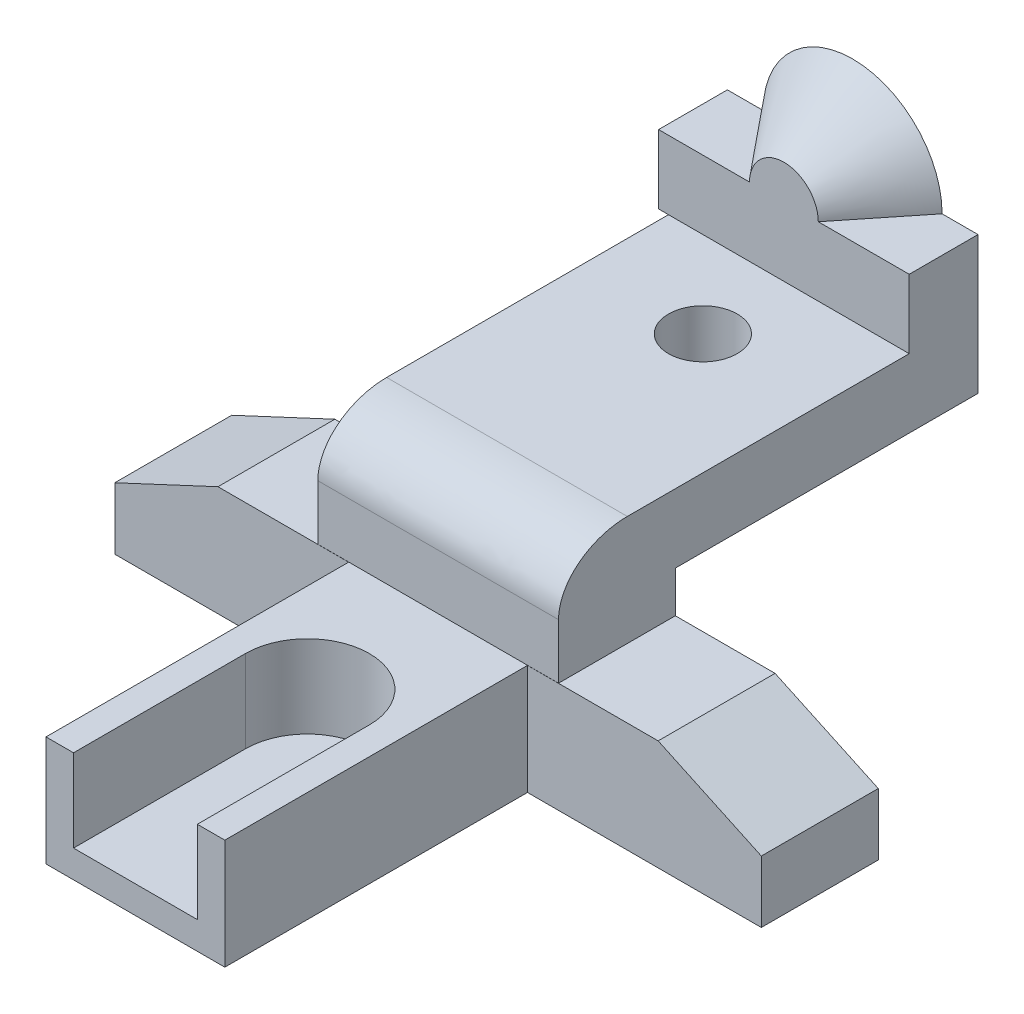
ISO-10303-21;
HEADER;
FILE_DESCRIPTION(('STEP AP214'),'2;1');
FILE_NAME('part.step','',(''),(''),'','','');
FILE_SCHEMA(('AUTOMOTIVE_DESIGN { 1 0 10303 214 1 1 1 1 }'));
ENDSEC;
DATA;
#1=APPLICATION_CONTEXT('core data for automotive mechanical design processes');
#2=APPLICATION_PROTOCOL_DEFINITION('international standard','automotive_design',2000,#1);
#3=PRODUCT_CONTEXT('',#1,'mechanical');
#4=PRODUCT('Part','Part','',(#3));
#5=PRODUCT_RELATED_PRODUCT_CATEGORY('part','',(#4));
#6=PRODUCT_DEFINITION_FORMATION('','',#4);
#7=PRODUCT_DEFINITION_CONTEXT('part definition',#1,'design');
#8=PRODUCT_DEFINITION('design','',#6,#7);
#9=PRODUCT_DEFINITION_SHAPE('','',#8);
#10=(LENGTH_UNIT() NAMED_UNIT(*) SI_UNIT(.MILLI.,.METRE.));
#11=(NAMED_UNIT(*) PLANE_ANGLE_UNIT() SI_UNIT($,.RADIAN.));
#12=(NAMED_UNIT(*) SI_UNIT($,.STERADIAN.) SOLID_ANGLE_UNIT());
#13=UNCERTAINTY_MEASURE_WITH_UNIT(LENGTH_MEASURE(1.E-05),#10,'distance_accuracy_value','');
#14=(GEOMETRIC_REPRESENTATION_CONTEXT(3) GLOBAL_UNCERTAINTY_ASSIGNED_CONTEXT((#13)) GLOBAL_UNIT_ASSIGNED_CONTEXT((#10,
#11,#12)) REPRESENTATION_CONTEXT('',''));
#15=CARTESIAN_POINT('',(0.,0.,0.));
#16=DIRECTION('',(0.,0.,1.));
#17=DIRECTION('',(1.,0.,0.));
#18=AXIS2_PLACEMENT_3D('',#15,#16,#17);
#19=CARTESIAN_POINT('',(0.,42.,0.));
#20=DIRECTION('',(0.,-1.,0.));
#21=DIRECTION('',(0.,0.,-1.));
#22=AXIS2_PLACEMENT_3D('',#19,#20,#21);
#23=PLANE('',#22);
#24=DIRECTION('',(-0.624695047554424,0.,-0.78086880944303));
#25=VECTOR('',#24,1.);
#26=CARTESIAN_POINT('',(41.2810746041064,42.,-51.));
#27=LINE('',#26,#25);
#28=CARTESIAN_POINT('',(41.2810746041064,42.,-51.));
#29=VERTEX_POINT('',#28);
#30=CARTESIAN_POINT('',(33.2810746041064,42.,-61.));
#31=VERTEX_POINT('',#30);
#32=EDGE_CURVE('E246',#29,#31,#27,.T.);
#33=ORIENTED_EDGE('',*,*,#32,.T.);
#34=DIRECTION('',(-1.,0.,0.));
#35=VECTOR('',#34,1.);
#36=CARTESIAN_POINT('',(28.0621492082127,42.,-61.));
#37=LINE('',#36,#35);
#38=CARTESIAN_POINT('',(28.0621492082127,42.,-61.));
#39=VERTEX_POINT('',#38);
#40=EDGE_CURVE('E236',#31,#39,#37,.T.);
#41=ORIENTED_EDGE('',*,*,#40,.T.);
#42=DIRECTION('',(0.,0.,1.));
#43=VECTOR('',#42,1.);
#44=CARTESIAN_POINT('',(28.0621492082127,42.,-51.));
#45=LINE('',#44,#43);
#46=CARTESIAN_POINT('',(28.0621492082127,42.,-51.));
#47=VERTEX_POINT('',#46);
#48=EDGE_CURVE('E235',#39,#47,#45,.T.);
#49=ORIENTED_EDGE('',*,*,#48,.T.);
#50=DIRECTION('',(1.,0.,0.));
#51=VECTOR('',#50,1.);
#52=CARTESIAN_POINT('',(28.0621492082127,42.,-51.));
#53=LINE('',#52,#51);
#54=EDGE_CURVE('E77',#47,#29,#53,.T.);
#55=ORIENTED_EDGE('',*,*,#54,.T.);
#56=EDGE_LOOP('',(#33,#41,#49,#55));
#57=FACE_BOUND('',#56,.T.);
#58=ADVANCED_FACE('F47',(#57),#23,.F.);
#59=DIRECTION('',(0.624695047554424,0.,-0.78086880944303));
#60=VECTOR('',#59,1.);
#61=CARTESIAN_POINT('',(51.2810746041064,42.,-51.));
#62=LINE('',#61,#60);
#63=CARTESIAN_POINT('',(51.2810746041064,42.,-51.));
#64=VERTEX_POINT('',#63);
#65=CARTESIAN_POINT('',(59.2810746041064,42.,-61.));
#66=VERTEX_POINT('',#65);
#67=EDGE_CURVE('E69',#64,#66,#62,.T.);
#68=ORIENTED_EDGE('',*,*,#67,.F.);
#69=CARTESIAN_POINT('',(64.5,42.,-51.));
#70=VERTEX_POINT('',#69);
#71=EDGE_CURVE('E270',#64,#70,#53,.T.);
#72=ORIENTED_EDGE('',*,*,#71,.T.);
#73=DIRECTION('',(0.,0.,-1.));
#74=VECTOR('',#73,1.);
#75=CARTESIAN_POINT('',(64.5,42.,-51.));
#76=LINE('',#75,#74);
#77=CARTESIAN_POINT('',(64.5,42.,-61.));
#78=VERTEX_POINT('',#77);
#79=EDGE_CURVE('E231',#70,#78,#76,.T.);
#80=ORIENTED_EDGE('',*,*,#79,.T.);
#81=EDGE_CURVE('E228',#78,#66,#37,.T.);
#82=ORIENTED_EDGE('',*,*,#81,.T.);
#83=EDGE_LOOP('',(#68,#72,#80,#82));
#84=FACE_BOUND('',#83,.T.);
#85=ADVANCED_FACE('F229',(#84),#23,.F.);
#86=CARTESIAN_POINT('',(0.,32.,0.));
#87=DIRECTION('',(0.,-1.,0.));
#88=DIRECTION('',(1.,0.,0.));
#89=AXIS2_PLACEMENT_3D('',#86,#87,#88);
#90=PLANE('',#89);
#91=CARTESIAN_POINT('',(47.,32.,-38.5));
#92=DIRECTION('',(0.,1.,0.));
#93=DIRECTION('',(-1.,0.,0.));
#94=AXIS2_PLACEMENT_3D('',#91,#92,#93);
#95=CIRCLE('',#94,5.);
#96=CARTESIAN_POINT('',(42.,32.,-38.5));
#97=VERTEX_POINT('',#96);
#98=EDGE_CURVE('E253',#97,#97,#95,.T.);
#99=ORIENTED_EDGE('',*,*,#98,.F.);
#100=EDGE_LOOP('',(#99));
#101=FACE_BOUND('',#100,.T.);
#102=DIRECTION('',(0.,0.,1.));
#103=VECTOR('',#102,1.);
#104=CARTESIAN_POINT('',(29.5,32.,-0.0186477456421091));
#105=LINE('',#104,#103);
#106=CARTESIAN_POINT('',(29.5,32.,-51.));
#107=VERTEX_POINT('',#106);
#108=CARTESIAN_POINT('',(29.5,32.,-10.0186477456421));
#109=VERTEX_POINT('',#108);
#110=EDGE_CURVE('E326',#107,#109,#105,.T.);
#111=ORIENTED_EDGE('',*,*,#110,.T.);
#112=CARTESIAN_POINT('',(66.25,32.,-10.0186477456421));
#113=CARTESIAN_POINT('',(53.4166666666667,32.,-10.0186477456421));
#114=CARTESIAN_POINT('',(40.5833333333333,32.,-10.0186477456421));
#115=CARTESIAN_POINT('',(27.75,32.,-10.0186477456421));
#116=(BOUNDED_CURVE() B_SPLINE_CURVE(3,(#112,#113,#114,#115),.UNSPECIFIED.,.F.,
.F.) B_SPLINE_CURVE_WITH_KNOTS((4,4),(0.02775,0.06625),
.UNSPECIFIED.) CURVE() GEOMETRIC_REPRESENTATION_ITEM() RATIONAL_B_SPLINE_CURVE((1.,1.,1.,1.)) REPRESENTATION_ITEM(''));
#117=CARTESIAN_POINT('',(64.5,32.,-10.0186477456421));
#118=VERTEX_POINT('',#117);
#119=EDGE_CURVE('E334',#109,#118,#116,.F.);
#120=ORIENTED_EDGE('',*,*,#119,.T.);
#121=DIRECTION('',(0.,0.,-1.));
#122=VECTOR('',#121,1.);
#123=CARTESIAN_POINT('',(64.5,32.,-0.0186477456421091));
#124=LINE('',#123,#122);
#125=CARTESIAN_POINT('',(64.5,32.,-51.));
#126=VERTEX_POINT('',#125);
#127=EDGE_CURVE('E322',#118,#126,#124,.T.);
#128=ORIENTED_EDGE('',*,*,#127,.T.);
#129=DIRECTION('',(1.,0.,0.));
#130=VECTOR('',#129,1.);
#131=CARTESIAN_POINT('',(28.0621492082127,32.,-51.));
#132=LINE('',#131,#130);
#133=EDGE_CURVE('E282',#107,#126,#132,.T.);
#134=ORIENTED_EDGE('',*,*,#133,.F.);
#135=EDGE_LOOP('',(#111,#120,#128,#134));
#136=FACE_BOUND('',#135,.T.);
#137=ADVANCED_FACE('F343',(#101,#136),#90,.F.);
#138=CARTESIAN_POINT('',(0.,0.,-17.));
#139=DIRECTION('',(0.,0.,1.));
#140=DIRECTION('',(1.,0.,0.));
#141=AXIS2_PLACEMENT_3D('',#138,#139,#140);
#142=PLANE('',#141);
#143=DIRECTION('',(-1.,0.,0.));
#144=VECTOR('',#143,1.);
#145=CARTESIAN_POINT('',(64.5,22.,-17.));
#146=LINE('',#145,#144);
#147=CARTESIAN_POINT('',(64.5,22.,-17.));
#148=VERTEX_POINT('',#147);
#149=CARTESIAN_POINT('',(29.5,22.,-17.));
#150=VERTEX_POINT('',#149);
#151=EDGE_CURVE('E294',#148,#150,#146,.T.);
#152=ORIENTED_EDGE('',*,*,#151,.F.);
#153=DIRECTION('',(0.,-1.,0.));
#154=VECTOR('',#153,1.);
#155=CARTESIAN_POINT('',(64.5,32.,-17.));
#156=LINE('',#155,#154);
#157=CARTESIAN_POINT('',(64.5,16.,-17.));
#158=VERTEX_POINT('',#157);
#159=EDGE_CURVE('E582',#148,#158,#156,.T.);
#160=ORIENTED_EDGE('',*,*,#159,.T.);
#161=DIRECTION('',(-1.,0.,0.));
#162=VECTOR('',#161,1.);
#163=CARTESIAN_POINT('',(79.,16.,-17.));
#164=LINE('',#163,#162);
#165=CARTESIAN_POINT('',(79.,16.,-17.));
#166=VERTEX_POINT('',#165);
#167=EDGE_CURVE('E458',#166,#158,#164,.T.);
#168=ORIENTED_EDGE('',*,*,#167,.F.);
#169=DIRECTION('',(-0.906183139995265,0.422885465331124,0.));
#170=VECTOR('',#169,1.);
#171=CARTESIAN_POINT('',(94.,9.,-17.));
#172=LINE('',#171,#170);
#173=CARTESIAN_POINT('',(94.,9.,-17.));
#174=VERTEX_POINT('',#173);
#175=EDGE_CURVE('E676',#174,#166,#172,.T.);
#176=ORIENTED_EDGE('',*,*,#175,.F.);
#177=DIRECTION('',(0.,1.,0.));
#178=VECTOR('',#177,1.);
#179=CARTESIAN_POINT('',(94.,0.,-17.));
#180=LINE('',#179,#178);
#181=CARTESIAN_POINT('',(94.,0.,-17.));
#182=VERTEX_POINT('',#181);
#183=EDGE_CURVE('E672',#182,#174,#180,.T.);
#184=ORIENTED_EDGE('',*,*,#183,.F.);
#185=DIRECTION('',(1.,0.,0.));
#186=VECTOR('',#185,1.);
#187=CARTESIAN_POINT('',(0.,0.,-17.));
#188=LINE('',#187,#186);
#189=CARTESIAN_POINT('',(0.,0.,-17.));
#190=VERTEX_POINT('',#189);
#191=EDGE_CURVE('E666',#190,#182,#188,.T.);
#192=ORIENTED_EDGE('',*,*,#191,.F.);
#193=DIRECTION('',(0.,-1.,0.));
#194=VECTOR('',#193,1.);
#195=CARTESIAN_POINT('',(0.,9.,-17.));
#196=LINE('',#195,#194);
#197=CARTESIAN_POINT('',(0.,9.,-17.));
#198=VERTEX_POINT('',#197);
#199=EDGE_CURVE('E493',#198,#190,#196,.T.);
#200=ORIENTED_EDGE('',*,*,#199,.F.);
#201=DIRECTION('',(-0.906183139995266,-0.422885465331123,0.));
#202=VECTOR('',#201,1.);
#203=CARTESIAN_POINT('',(15.,16.,-17.));
#204=LINE('',#203,#202);
#205=CARTESIAN_POINT('',(15.,16.,-17.));
#206=VERTEX_POINT('',#205);
#207=EDGE_CURVE('E453',#206,#198,#204,.T.);
#208=ORIENTED_EDGE('',*,*,#207,.F.);
#209=CARTESIAN_POINT('',(29.5,16.,-17.));
#210=VERTEX_POINT('',#209);
#211=EDGE_CURVE('E464',#210,#206,#164,.T.);
#212=ORIENTED_EDGE('',*,*,#211,.F.);
#213=DIRECTION('',(0.,-1.,0.));
#214=VECTOR('',#213,1.);
#215=CARTESIAN_POINT('',(29.5,32.,-17.));
#216=LINE('',#215,#214);
#217=EDGE_CURVE('E555',#150,#210,#216,.T.);
#218=ORIENTED_EDGE('',*,*,#217,.F.);
#219=EDGE_LOOP('',(#152,#160,#168,#176,#184,#192,#200,#208,#212,#218));
#220=FACE_BOUND('',#219,.T.);
#221=ADVANCED_FACE('F353',(#220),#142,.F.);
#222=CARTESIAN_POINT('',(0.,0.,0.));
#223=DIRECTION('',(0.,0.,1.));
#224=DIRECTION('',(1.,0.,0.));
#225=AXIS2_PLACEMENT_3D('',#222,#223,#224);
#226=PLANE('',#225);
#227=DIRECTION('',(0.,1.,0.));
#228=VECTOR('',#227,1.);
#229=CARTESIAN_POINT('',(60.,16.,0.));
#230=LINE('',#229,#228);
#231=CARTESIAN_POINT('',(60.,0.,0.));
#232=VERTEX_POINT('',#231);
#233=CARTESIAN_POINT('',(60.,16.,0.));
#234=VERTEX_POINT('',#233);
#235=EDGE_CURVE('E623',#232,#234,#230,.T.);
#236=ORIENTED_EDGE('',*,*,#235,.F.);
#237=DIRECTION('',(1.,0.,0.));
#238=VECTOR('',#237,1.);
#239=CARTESIAN_POINT('',(0.,0.,0.));
#240=LINE('',#239,#238);
#241=CARTESIAN_POINT('',(94.,0.,0.));
#242=VERTEX_POINT('',#241);
#243=EDGE_CURVE('E472',#232,#242,#240,.T.);
#244=ORIENTED_EDGE('',*,*,#243,.T.);
#245=DIRECTION('',(0.,1.,0.));
#246=VECTOR('',#245,1.);
#247=CARTESIAN_POINT('',(94.,0.,0.));
#248=LINE('',#247,#246);
#249=CARTESIAN_POINT('',(94.,9.,0.));
#250=VERTEX_POINT('',#249);
#251=EDGE_CURVE('E477',#242,#250,#248,.T.);
#252=ORIENTED_EDGE('',*,*,#251,.T.);
#253=DIRECTION('',(-0.906183139995265,0.422885465331124,0.));
#254=VECTOR('',#253,1.);
#255=CARTESIAN_POINT('',(94.,9.,0.));
#256=LINE('',#255,#254);
#257=CARTESIAN_POINT('',(79.,16.,0.));
#258=VERTEX_POINT('',#257);
#259=EDGE_CURVE('E481',#250,#258,#256,.T.);
#260=ORIENTED_EDGE('',*,*,#259,.T.);
#261=DIRECTION('',(-1.,0.,0.));
#262=VECTOR('',#261,1.);
#263=CARTESIAN_POINT('',(79.,16.,0.));
#264=LINE('',#263,#262);
#265=EDGE_CURVE('E485',#258,#234,#264,.T.);
#266=ORIENTED_EDGE('',*,*,#265,.T.);
#267=EDGE_LOOP('',(#236,#244,#252,#260,#266));
#268=FACE_BOUND('',#267,.T.);
#269=ADVANCED_FACE('F517',(#268),#226,.T.);
#270=CARTESIAN_POINT('',(0.,9.,-17.));
#271=DIRECTION('',(-1.,0.,0.));
#272=DIRECTION('',(0.,-1.,0.));
#273=AXIS2_PLACEMENT_3D('',#270,#271,#272);
#274=PLANE('',#273);
#275=DIRECTION('',(0.,-1.,0.));
#276=VECTOR('',#275,1.);
#277=CARTESIAN_POINT('',(0.,9.,0.));
#278=LINE('',#277,#276);
#279=CARTESIAN_POINT('',(0.,9.,0.));
#280=VERTEX_POINT('',#279);
#281=CARTESIAN_POINT('',(0.,0.,0.));
#282=VERTEX_POINT('',#281);
#283=EDGE_CURVE('E468',#280,#282,#278,.T.);
#284=ORIENTED_EDGE('',*,*,#283,.F.);
#285=DIRECTION('',(0.,0.,1.));
#286=VECTOR('',#285,1.);
#287=CARTESIAN_POINT('',(0.,9.,-17.));
#288=LINE('',#287,#286);
#289=EDGE_CURVE('E425',#198,#280,#288,.T.);
#290=ORIENTED_EDGE('',*,*,#289,.F.);
#291=ORIENTED_EDGE('',*,*,#199,.T.);
#292=DIRECTION('',(0.,0.,1.));
#293=VECTOR('',#292,1.);
#294=CARTESIAN_POINT('',(0.,0.,-17.));
#295=LINE('',#294,#293);
#296=EDGE_CURVE('E451',#190,#282,#295,.T.);
#297=ORIENTED_EDGE('',*,*,#296,.T.);
#298=EDGE_LOOP('',(#284,#290,#291,#297));
#299=FACE_BOUND('',#298,.T.);
#300=ADVANCED_FACE('F508',(#299),#274,.T.);
#301=CARTESIAN_POINT('',(15.,16.,-17.));
#302=DIRECTION('',(-0.422885465331123,0.906183139995266,0.));
#303=DIRECTION('',(-0.906183139995266,-0.422885465331123,0.));
#304=AXIS2_PLACEMENT_3D('',#301,#302,#303);
#305=PLANE('',#304);
#306=DIRECTION('',(-0.906183139995266,-0.422885465331123,0.));
#307=VECTOR('',#306,1.);
#308=CARTESIAN_POINT('',(15.,16.,0.));
#309=LINE('',#308,#307);
#310=CARTESIAN_POINT('',(15.,16.,0.));
#311=VERTEX_POINT('',#310);
#312=EDGE_CURVE('E440',#311,#280,#309,.T.);
#313=ORIENTED_EDGE('',*,*,#312,.F.);
#314=DIRECTION('',(0.,0.,1.));
#315=VECTOR('',#314,1.);
#316=CARTESIAN_POINT('',(15.,16.,-17.));
#317=LINE('',#316,#315);
#318=EDGE_CURVE('E429',#206,#311,#317,.T.);
#319=ORIENTED_EDGE('',*,*,#318,.F.);
#320=ORIENTED_EDGE('',*,*,#207,.T.);
#321=ORIENTED_EDGE('',*,*,#289,.T.);
#322=EDGE_LOOP('',(#313,#319,#320,#321));
#323=FACE_BOUND('',#322,.T.);
#324=ADVANCED_FACE('F506',(#323),#305,.T.);
#325=CARTESIAN_POINT('',(79.,16.,-17.));
#326=DIRECTION('',(0.,1.,0.));
#327=DIRECTION('',(-1.,0.,0.));
#328=AXIS2_PLACEMENT_3D('',#325,#326,#327);
#329=PLANE('',#328);
#330=DIRECTION('',(0.,0.,-1.));
#331=VECTOR('',#330,1.);
#332=CARTESIAN_POINT('',(64.5,16.,-0.0186477456421091));
#333=LINE('',#332,#331);
#334=CARTESIAN_POINT('',(64.5,16.,-0.0186477456421091));
#335=VERTEX_POINT('',#334);
#336=EDGE_CURVE('E315',#335,#158,#333,.T.);
#337=ORIENTED_EDGE('',*,*,#336,.F.);
#338=DIRECTION('',(1.,0.,0.));
#339=VECTOR('',#338,1.);
#340=CARTESIAN_POINT('',(29.5,16.,-0.0186477456421091));
#341=LINE('',#340,#339);
#342=CARTESIAN_POINT('',(29.5,16.,-0.0186477456421091));
#343=VERTEX_POINT('',#342);
#344=EDGE_CURVE('E327',#343,#335,#341,.T.);
#345=ORIENTED_EDGE('',*,*,#344,.F.);
#346=DIRECTION('',(0.,0.,1.));
#347=VECTOR('',#346,1.);
#348=CARTESIAN_POINT('',(29.5,16.,-0.0186477456421091));
#349=LINE('',#348,#347);
#350=EDGE_CURVE('E570',#210,#343,#349,.T.);
#351=ORIENTED_EDGE('',*,*,#350,.F.);
#352=ORIENTED_EDGE('',*,*,#211,.T.);
#353=ORIENTED_EDGE('',*,*,#318,.T.);
#354=CARTESIAN_POINT('',(34.,16.,0.));
#355=VERTEX_POINT('',#354);
#356=EDGE_CURVE('E484',#355,#311,#264,.T.);
#357=ORIENTED_EDGE('',*,*,#356,.F.);
#358=DIRECTION('',(0.,0.,-1.));
#359=VECTOR('',#358,1.);
#360=CARTESIAN_POINT('',(34.,16.,44.));
#361=LINE('',#360,#359);
#362=CARTESIAN_POINT('',(34.,16.,44.));
#363=VERTEX_POINT('',#362);
#364=EDGE_CURVE('E653',#363,#355,#361,.T.);
#365=ORIENTED_EDGE('',*,*,#364,.F.);
#366=DIRECTION('',(-1.,0.,0.));
#367=VECTOR('',#366,1.);
#368=CARTESIAN_POINT('',(34.,16.,44.));
#369=LINE('',#368,#367);
#370=CARTESIAN_POINT('',(38.,16.,44.));
#371=VERTEX_POINT('',#370);
#372=EDGE_CURVE('E633',#371,#363,#369,.T.);
#373=ORIENTED_EDGE('',*,*,#372,.F.);
#374=DIRECTION('',(0.,0.,1.));
#375=VECTOR('',#374,1.);
#376=CARTESIAN_POINT('',(38.,16.,44.));
#377=LINE('',#376,#375);
#378=CARTESIAN_POINT('',(38.,16.,19.));
#379=VERTEX_POINT('',#378);
#380=EDGE_CURVE('E589',#379,#371,#377,.T.);
#381=ORIENTED_EDGE('',*,*,#380,.F.);
#382=CARTESIAN_POINT('',(47.,16.,19.));
#383=DIRECTION('',(0.,1.,0.));
#384=DIRECTION('',(-1.,0.,0.));
#385=AXIS2_PLACEMENT_3D('',#382,#383,#384);
#386=CIRCLE('',#385,9.);
#387=CARTESIAN_POINT('',(56.,16.,19.));
#388=VERTEX_POINT('',#387);
#389=EDGE_CURVE('E585',#388,#379,#386,.T.);
#390=ORIENTED_EDGE('',*,*,#389,.F.);
#391=DIRECTION('',(0.,0.,-1.));
#392=VECTOR('',#391,1.);
#393=CARTESIAN_POINT('',(56.,16.,44.));
#394=LINE('',#393,#392);
#395=CARTESIAN_POINT('',(56.,16.,44.));
#396=VERTEX_POINT('',#395);
#397=EDGE_CURVE('E592',#396,#388,#394,.T.);
#398=ORIENTED_EDGE('',*,*,#397,.F.);
#399=CARTESIAN_POINT('',(60.,16.,44.));
#400=VERTEX_POINT('',#399);
#401=EDGE_CURVE('E636',#400,#396,#369,.T.);
#402=ORIENTED_EDGE('',*,*,#401,.F.);
#403=DIRECTION('',(0.,0.,-1.));
#404=VECTOR('',#403,1.);
#405=CARTESIAN_POINT('',(60.,16.,44.));
#406=LINE('',#405,#404);
#407=EDGE_CURVE('E473',#400,#234,#406,.T.);
#408=ORIENTED_EDGE('',*,*,#407,.T.);
#409=ORIENTED_EDGE('',*,*,#265,.F.);
#410=DIRECTION('',(0.,0.,1.));
#411=VECTOR('',#410,1.);
#412=CARTESIAN_POINT('',(79.,16.,-17.));
#413=LINE('',#412,#411);
#414=EDGE_CURVE('E437',#166,#258,#413,.T.);
#415=ORIENTED_EDGE('',*,*,#414,.F.);
#416=ORIENTED_EDGE('',*,*,#167,.T.);
#417=EDGE_LOOP('',(#337,#345,#351,#352,#353,#357,#365,#373,#381,#390,#398,#402,#408,#409,#415,#416));
#418=FACE_BOUND('',#417,.T.);
#419=ADVANCED_FACE('F503',(#418),#329,.T.);
#420=CARTESIAN_POINT('',(94.,9.,-17.));
#421=DIRECTION('',(0.422885465331124,0.906183139995265,0.));
#422=DIRECTION('',(-0.906183139995266,0.422885465331124,0.));
#423=AXIS2_PLACEMENT_3D('',#420,#421,#422);
#424=PLANE('',#423);
#425=ORIENTED_EDGE('',*,*,#259,.F.);
#426=DIRECTION('',(0.,0.,1.));
#427=VECTOR('',#426,1.);
#428=CARTESIAN_POINT('',(94.,9.,-17.));
#429=LINE('',#428,#427);
#430=EDGE_CURVE('E445',#174,#250,#429,.T.);
#431=ORIENTED_EDGE('',*,*,#430,.F.);
#432=ORIENTED_EDGE('',*,*,#175,.T.);
#433=ORIENTED_EDGE('',*,*,#414,.T.);
#434=EDGE_LOOP('',(#425,#431,#432,#433));
#435=FACE_BOUND('',#434,.T.);
#436=ADVANCED_FACE('F515',(#435),#424,.T.);
#437=CARTESIAN_POINT('',(94.,0.,-17.));
#438=DIRECTION('',(1.,0.,0.));
#439=DIRECTION('',(0.,0.,-1.));
#440=AXIS2_PLACEMENT_3D('',#437,#438,#439);
#441=PLANE('',#440);
#442=ORIENTED_EDGE('',*,*,#251,.F.);
#443=DIRECTION('',(0.,0.,1.));
#444=VECTOR('',#443,1.);
#445=CARTESIAN_POINT('',(94.,0.,-17.));
#446=LINE('',#445,#444);
#447=EDGE_CURVE('E448',#182,#242,#446,.T.);
#448=ORIENTED_EDGE('',*,*,#447,.F.);
#449=ORIENTED_EDGE('',*,*,#183,.T.);
#450=ORIENTED_EDGE('',*,*,#430,.T.);
#451=EDGE_LOOP('',(#442,#448,#449,#450));
#452=FACE_BOUND('',#451,.T.);
#453=ADVANCED_FACE('F670',(#452),#441,.T.);
#454=CARTESIAN_POINT('',(0.,0.,-17.));
#455=DIRECTION('',(0.,-1.,0.));
#456=DIRECTION('',(0.,0.,-1.));
#457=AXIS2_PLACEMENT_3D('',#454,#455,#456);
#458=PLANE('',#457);
#459=CARTESIAN_POINT('',(34.,0.,0.));
#460=VERTEX_POINT('',#459);
#461=EDGE_CURVE('E474',#282,#460,#240,.T.);
#462=ORIENTED_EDGE('',*,*,#461,.F.);
#463=ORIENTED_EDGE('',*,*,#296,.F.);
#464=ORIENTED_EDGE('',*,*,#191,.T.);
#465=ORIENTED_EDGE('',*,*,#447,.T.);
#466=ORIENTED_EDGE('',*,*,#243,.F.);
#467=DIRECTION('',(0.,0.,-1.));
#468=VECTOR('',#467,1.);
#469=CARTESIAN_POINT('',(60.,0.,44.));
#470=LINE('',#469,#468);
#471=CARTESIAN_POINT('',(60.,0.,44.));
#472=VERTEX_POINT('',#471);
#473=EDGE_CURVE('E645',#472,#232,#470,.T.);
#474=ORIENTED_EDGE('',*,*,#473,.F.);
#475=DIRECTION('',(1.,0.,0.));
#476=VECTOR('',#475,1.);
#477=CARTESIAN_POINT('',(34.,0.,44.));
#478=LINE('',#477,#476);
#479=CARTESIAN_POINT('',(34.,0.,44.));
#480=VERTEX_POINT('',#479);
#481=EDGE_CURVE('E642',#480,#472,#478,.T.);
#482=ORIENTED_EDGE('',*,*,#481,.F.);
#483=DIRECTION('',(0.,0.,-1.));
#484=VECTOR('',#483,1.);
#485=CARTESIAN_POINT('',(34.,0.,44.));
#486=LINE('',#485,#484);
#487=EDGE_CURVE('E649',#480,#460,#486,.T.);
#488=ORIENTED_EDGE('',*,*,#487,.T.);
#489=EDGE_LOOP('',(#462,#463,#464,#465,#466,#474,#482,#488));
#490=FACE_BOUND('',#489,.T.);
#491=ADVANCED_FACE('F664',(#490),#458,.T.);
#492=DIRECTION('',(0.,-1.,0.));
#493=VECTOR('',#492,1.);
#494=CARTESIAN_POINT('',(34.,16.,0.));
#495=LINE('',#494,#493);
#496=EDGE_CURVE('E498',#355,#460,#495,.T.);
#497=ORIENTED_EDGE('',*,*,#496,.F.);
#498=ORIENTED_EDGE('',*,*,#356,.T.);
#499=ORIENTED_EDGE('',*,*,#312,.T.);
#500=ORIENTED_EDGE('',*,*,#283,.T.);
#501=ORIENTED_EDGE('',*,*,#461,.T.);
#502=EDGE_LOOP('',(#497,#498,#499,#500,#501));
#503=FACE_BOUND('',#502,.T.);
#504=ADVANCED_FACE('F496',(#503),#226,.T.);
#505=CARTESIAN_POINT('',(60.,16.,44.));
#506=DIRECTION('',(-1.,0.,0.));
#507=DIRECTION('',(0.,0.,1.));
#508=AXIS2_PLACEMENT_3D('',#505,#506,#507);
#509=PLANE('',#508);
#510=ORIENTED_EDGE('',*,*,#235,.T.);
#511=ORIENTED_EDGE('',*,*,#407,.F.);
#512=DIRECTION('',(0.,1.,0.));
#513=VECTOR('',#512,1.);
#514=CARTESIAN_POINT('',(60.,16.,44.));
#515=LINE('',#514,#513);
#516=EDGE_CURVE('E629',#472,#400,#515,.T.);
#517=ORIENTED_EDGE('',*,*,#516,.F.);
#518=ORIENTED_EDGE('',*,*,#473,.T.);
#519=EDGE_LOOP('',(#510,#511,#517,#518));
#520=FACE_BOUND('',#519,.T.);
#521=ADVANCED_FACE('F682',(#520),#509,.F.);
#522=CARTESIAN_POINT('',(34.,16.,44.));
#523=DIRECTION('',(1.,0.,0.));
#524=DIRECTION('',(0.,0.,-1.));
#525=AXIS2_PLACEMENT_3D('',#522,#523,#524);
#526=PLANE('',#525);
#527=ORIENTED_EDGE('',*,*,#496,.T.);
#528=ORIENTED_EDGE('',*,*,#487,.F.);
#529=DIRECTION('',(0.,-1.,0.));
#530=VECTOR('',#529,1.);
#531=CARTESIAN_POINT('',(34.,16.,44.));
#532=LINE('',#531,#530);
#533=EDGE_CURVE('E640',#363,#480,#532,.T.);
#534=ORIENTED_EDGE('',*,*,#533,.F.);
#535=ORIENTED_EDGE('',*,*,#364,.T.);
#536=EDGE_LOOP('',(#527,#528,#534,#535));
#537=FACE_BOUND('',#536,.T.);
#538=ADVANCED_FACE('F691',(#537),#526,.F.);
#539=CARTESIAN_POINT('',(0.,0.,44.));
#540=DIRECTION('',(0.,0.,1.));
#541=DIRECTION('',(1.,0.,0.));
#542=AXIS2_PLACEMENT_3D('',#539,#540,#541);
#543=PLANE('',#542);
#544=DIRECTION('',(0.,1.,0.));
#545=VECTOR('',#544,1.);
#546=CARTESIAN_POINT('',(56.,4.,44.));
#547=LINE('',#546,#545);
#548=CARTESIAN_POINT('',(56.,4.,44.));
#549=VERTEX_POINT('',#548);
#550=EDGE_CURVE('E617',#549,#396,#547,.T.);
#551=ORIENTED_EDGE('',*,*,#550,.F.);
#552=DIRECTION('',(1.,0.,0.));
#553=VECTOR('',#552,1.);
#554=CARTESIAN_POINT('',(38.,4.,44.));
#555=LINE('',#554,#553);
#556=CARTESIAN_POINT('',(38.,4.,44.));
#557=VERTEX_POINT('',#556);
#558=EDGE_CURVE('E603',#557,#549,#555,.T.);
#559=ORIENTED_EDGE('',*,*,#558,.F.);
#560=DIRECTION('',(0.,1.,0.));
#561=VECTOR('',#560,1.);
#562=CARTESIAN_POINT('',(38.,4.,44.));
#563=LINE('',#562,#561);
#564=EDGE_CURVE('E613',#557,#371,#563,.T.);
#565=ORIENTED_EDGE('',*,*,#564,.T.);
#566=ORIENTED_EDGE('',*,*,#372,.T.);
#567=ORIENTED_EDGE('',*,*,#533,.T.);
#568=ORIENTED_EDGE('',*,*,#481,.T.);
#569=ORIENTED_EDGE('',*,*,#516,.T.);
#570=ORIENTED_EDGE('',*,*,#401,.T.);
#571=EDGE_LOOP('',(#551,#559,#565,#566,#567,#568,#569,#570));
#572=FACE_BOUND('',#571,.T.);
#573=ADVANCED_FACE('F687',(#572),#543,.T.);
#574=CARTESIAN_POINT('',(47.,4.,19.));
#575=DIRECTION('',(0.,1.,0.));
#576=DIRECTION('',(-1.,0.,0.));
#577=AXIS2_PLACEMENT_3D('',#574,#575,#576);
#578=CYLINDRICAL_SURFACE('',#577,9.);
#579=ORIENTED_EDGE('',*,*,#389,.T.);
#580=DIRECTION('',(0.,1.,0.));
#581=VECTOR('',#580,1.);
#582=CARTESIAN_POINT('',(38.,4.,19.));
#583=LINE('',#582,#581);
#584=CARTESIAN_POINT('',(38.,4.,19.));
#585=VERTEX_POINT('',#584);
#586=EDGE_CURVE('E610',#585,#379,#583,.T.);
#587=ORIENTED_EDGE('',*,*,#586,.F.);
#588=CARTESIAN_POINT('',(47.,4.,19.));
#589=DIRECTION('',(0.,1.,0.));
#590=DIRECTION('',(-1.,0.,0.));
#591=AXIS2_PLACEMENT_3D('',#588,#589,#590);
#592=CIRCLE('',#591,9.);
#593=CARTESIAN_POINT('',(56.,4.,19.));
#594=VERTEX_POINT('',#593);
#595=EDGE_CURVE('E596',#594,#585,#592,.T.);
#596=ORIENTED_EDGE('',*,*,#595,.F.);
#597=DIRECTION('',(0.,1.,0.));
#598=VECTOR('',#597,1.);
#599=CARTESIAN_POINT('',(56.,4.,19.));
#600=LINE('',#599,#598);
#601=EDGE_CURVE('E620',#594,#388,#600,.T.);
#602=ORIENTED_EDGE('',*,*,#601,.T.);
#603=EDGE_LOOP('',(#579,#587,#596,#602));
#604=FACE_BOUND('',#603,.T.);
#605=ADVANCED_FACE('F706',(#604),#578,.F.);
#606=CARTESIAN_POINT('',(56.,4.,44.));
#607=DIRECTION('',(1.,0.,0.));
#608=DIRECTION('',(0.,1.,0.));
#609=AXIS2_PLACEMENT_3D('',#606,#607,#608);
#610=PLANE('',#609);
#611=ORIENTED_EDGE('',*,*,#397,.T.);
#612=ORIENTED_EDGE('',*,*,#601,.F.);
#613=DIRECTION('',(0.,0.,-1.));
#614=VECTOR('',#613,1.);
#615=CARTESIAN_POINT('',(56.,4.,44.));
#616=LINE('',#615,#614);
#617=EDGE_CURVE('E606',#549,#594,#616,.T.);
#618=ORIENTED_EDGE('',*,*,#617,.F.);
#619=ORIENTED_EDGE('',*,*,#550,.T.);
#620=EDGE_LOOP('',(#611,#612,#618,#619));
#621=FACE_BOUND('',#620,.T.);
#622=ADVANCED_FACE('F703',(#621),#610,.F.);
#623=CARTESIAN_POINT('',(38.,4.,44.));
#624=DIRECTION('',(-1.,0.,0.));
#625=DIRECTION('',(0.,-1.,0.));
#626=AXIS2_PLACEMENT_3D('',#623,#624,#625);
#627=PLANE('',#626);
#628=ORIENTED_EDGE('',*,*,#380,.T.);
#629=ORIENTED_EDGE('',*,*,#564,.F.);
#630=DIRECTION('',(0.,0.,1.));
#631=VECTOR('',#630,1.);
#632=CARTESIAN_POINT('',(38.,4.,44.));
#633=LINE('',#632,#631);
#634=EDGE_CURVE('E600',#585,#557,#633,.T.);
#635=ORIENTED_EDGE('',*,*,#634,.F.);
#636=ORIENTED_EDGE('',*,*,#586,.T.);
#637=EDGE_LOOP('',(#628,#629,#635,#636));
#638=FACE_BOUND('',#637,.T.);
#639=ADVANCED_FACE('F696',(#638),#627,.F.);
#640=CARTESIAN_POINT('',(47.,4.,19.));
#641=DIRECTION('',(0.,1.,0.));
#642=DIRECTION('',(-1.,0.,0.));
#643=AXIS2_PLACEMENT_3D('',#640,#641,#642);
#644=PLANE('',#643);
#645=ORIENTED_EDGE('',*,*,#595,.T.);
#646=ORIENTED_EDGE('',*,*,#634,.T.);
#647=ORIENTED_EDGE('',*,*,#558,.T.);
#648=ORIENTED_EDGE('',*,*,#617,.T.);
#649=EDGE_LOOP('',(#645,#646,#647,#648));
#650=FACE_BOUND('',#649,.T.);
#651=ADVANCED_FACE('F701',(#650),#644,.T.);
#652=CARTESIAN_POINT('',(64.5,32.,-0.0186477456421091));
#653=DIRECTION('',(-1.,0.,0.));
#654=DIRECTION('',(0.,-1.,0.));
#655=AXIS2_PLACEMENT_3D('',#652,#653,#654);
#656=PLANE('',#655);
#657=ORIENTED_EDGE('',*,*,#127,.F.);
#658=CARTESIAN_POINT('',(64.5,24.,-0.0186477456421089));
#659=CARTESIAN_POINT('',(64.5,32.,-0.0186477456421055));
#660=CARTESIAN_POINT('',(64.5,32.,-10.0186477456421));
#661=(BOUNDED_CURVE() B_SPLINE_CURVE(2,(#658,#659,#660),.UNSPECIFIED.,.F.,
.F.) B_SPLINE_CURVE_WITH_KNOTS((3,3),(0.,1.),
.UNSPECIFIED.) CURVE() GEOMETRIC_REPRESENTATION_ITEM() RATIONAL_B_SPLINE_CURVE((1.,
0.707106781186547,1.)) REPRESENTATION_ITEM(''));
#662=CARTESIAN_POINT('',(64.5,24.,-0.0186477456421091));
#663=VERTEX_POINT('',#662);
#664=EDGE_CURVE('E392',#118,#663,#661,.F.);
#665=ORIENTED_EDGE('',*,*,#664,.T.);
#666=DIRECTION('',(0.,-1.,0.));
#667=VECTOR('',#666,1.);
#668=CARTESIAN_POINT('',(64.5,32.,-0.0186477456421091));
#669=LINE('',#668,#667);
#670=EDGE_CURVE('E340',#663,#335,#669,.T.);
#671=ORIENTED_EDGE('',*,*,#670,.T.);
#672=ORIENTED_EDGE('',*,*,#336,.T.);
#673=ORIENTED_EDGE('',*,*,#159,.F.);
#674=DIRECTION('',(0.,0.,1.));
#675=VECTOR('',#674,1.);
#676=CARTESIAN_POINT('',(64.5,22.,-61.));
#677=LINE('',#676,#675);
#678=CARTESIAN_POINT('',(64.5,22.,-61.));
#679=VERTEX_POINT('',#678);
#680=EDGE_CURVE('E311',#679,#148,#677,.T.);
#681=ORIENTED_EDGE('',*,*,#680,.F.);
#682=DIRECTION('',(0.,-1.,0.));
#683=VECTOR('',#682,1.);
#684=CARTESIAN_POINT('',(64.5,22.,-61.));
#685=LINE('',#684,#683);
#686=EDGE_CURVE('E298',#78,#679,#685,.T.);
#687=ORIENTED_EDGE('',*,*,#686,.F.);
#688=ORIENTED_EDGE('',*,*,#79,.F.);
#689=DIRECTION('',(0.,-1.,0.));
#690=VECTOR('',#689,1.);
#691=CARTESIAN_POINT('',(64.5,42.,-51.));
#692=LINE('',#691,#690);
#693=EDGE_CURVE('E273',#70,#126,#692,.T.);
#694=ORIENTED_EDGE('',*,*,#693,.T.);
#695=EDGE_LOOP('',(#657,#665,#671,#672,#673,#681,#687,#688,#694));
#696=FACE_BOUND('',#695,.T.);
#697=ADVANCED_FACE('F809',(#696),#656,.F.);
#698=CARTESIAN_POINT('',(29.5,32.,-0.0186477456421091));
#699=DIRECTION('',(1.,0.,0.));
#700=DIRECTION('',(0.,1.,0.));
#701=AXIS2_PLACEMENT_3D('',#698,#699,#700);
#702=PLANE('',#701);
#703=DIRECTION('',(0.,-1.,0.));
#704=VECTOR('',#703,1.);
#705=CARTESIAN_POINT('',(29.5,32.,-0.0186477456421091));
#706=LINE('',#705,#704);
#707=CARTESIAN_POINT('',(29.5,24.,-0.0186477456421091));
#708=VERTEX_POINT('',#707);
#709=EDGE_CURVE('E579',#708,#343,#706,.T.);
#710=ORIENTED_EDGE('',*,*,#709,.F.);
#711=CARTESIAN_POINT('',(29.5,32.,-10.0186477456421));
#712=CARTESIAN_POINT('',(29.5,32.,-0.0186477456421089));
#713=CARTESIAN_POINT('',(29.5,24.,-0.0186477456421089));
#714=(BOUNDED_CURVE() B_SPLINE_CURVE(2,(#711,#712,#713),.UNSPECIFIED.,.F.,
.F.) B_SPLINE_CURVE_WITH_KNOTS((3,3),(0.,1.),
.UNSPECIFIED.) CURVE() GEOMETRIC_REPRESENTATION_ITEM() RATIONAL_B_SPLINE_CURVE((1.,
0.707106781186548,1.)) REPRESENTATION_ITEM(''));
#715=EDGE_CURVE('E13',#708,#109,#714,.F.);
#716=ORIENTED_EDGE('',*,*,#715,.T.);
#717=ORIENTED_EDGE('',*,*,#110,.F.);
#718=CARTESIAN_POINT('',(29.5,32.,-61.));
#719=VERTEX_POINT('',#718);
#720=EDGE_CURVE('E318',#719,#107,#105,.T.);
#721=ORIENTED_EDGE('',*,*,#720,.F.);
#722=DIRECTION('',(0.,1.,0.));
#723=VECTOR('',#722,1.);
#724=CARTESIAN_POINT('',(29.5,22.,-61.));
#725=LINE('',#724,#723);
#726=CARTESIAN_POINT('',(29.5,22.,-61.));
#727=VERTEX_POINT('',#726);
#728=EDGE_CURVE('E295',#727,#719,#725,.T.);
#729=ORIENTED_EDGE('',*,*,#728,.F.);
#730=DIRECTION('',(0.,0.,1.));
#731=VECTOR('',#730,1.);
#732=CARTESIAN_POINT('',(29.5,22.,-61.));
#733=LINE('',#732,#731);
#734=EDGE_CURVE('E304',#727,#150,#733,.T.);
#735=ORIENTED_EDGE('',*,*,#734,.T.);
#736=ORIENTED_EDGE('',*,*,#217,.T.);
#737=ORIENTED_EDGE('',*,*,#350,.T.);
#738=EDGE_LOOP('',(#710,#716,#717,#721,#729,#735,#736,#737));
#739=FACE_BOUND('',#738,.T.);
#740=ADVANCED_FACE('F361',(#739),#702,.F.);
#741=CARTESIAN_POINT('',(29.5,32.,-0.0186477456421091));
#742=DIRECTION('',(0.,0.,-1.));
#743=DIRECTION('',(-1.,0.,0.));
#744=AXIS2_PLACEMENT_3D('',#741,#742,#743);
#745=PLANE('',#744);
#746=ORIENTED_EDGE('',*,*,#670,.F.);
#747=CARTESIAN_POINT('',(27.75,24.,-0.0186477456421089));
#748=CARTESIAN_POINT('',(40.5833333333333,24.,-0.0186477456421089));
#749=CARTESIAN_POINT('',(53.4166666666667,24.,-0.0186477456421089));
#750=CARTESIAN_POINT('',(66.25,24.,-0.0186477456421089));
#751=(BOUNDED_CURVE() B_SPLINE_CURVE(3,(#747,#748,#749,#750),.UNSPECIFIED.,.F.,
.F.) B_SPLINE_CURVE_WITH_KNOTS((4,4),(0.02775,0.06625),
.UNSPECIFIED.) CURVE() GEOMETRIC_REPRESENTATION_ITEM() RATIONAL_B_SPLINE_CURVE((1.,1.,1.,1.)) REPRESENTATION_ITEM(''));
#752=EDGE_CURVE('E62',#663,#708,#751,.F.);
#753=ORIENTED_EDGE('',*,*,#752,.T.);
#754=ORIENTED_EDGE('',*,*,#709,.T.);
#755=ORIENTED_EDGE('',*,*,#344,.T.);
#756=EDGE_LOOP('',(#746,#753,#754,#755));
#757=FACE_BOUND('',#756,.T.);
#758=ADVANCED_FACE('F357',(#757),#745,.F.);
#759=CARTESIAN_POINT('',(64.5,22.,-61.));
#760=DIRECTION('',(0.,1.,0.));
#761=DIRECTION('',(0.,0.,1.));
#762=AXIS2_PLACEMENT_3D('',#759,#760,#761);
#763=PLANE('',#762);
#764=CARTESIAN_POINT('',(47.,22.,-38.5));
#765=DIRECTION('',(0.,1.,0.));
#766=DIRECTION('',(-1.,0.,0.));
#767=AXIS2_PLACEMENT_3D('',#764,#765,#766);
#768=CIRCLE('',#767,5.);
#769=CARTESIAN_POINT('',(42.,22.,-38.5));
#770=VERTEX_POINT('',#769);
#771=EDGE_CURVE('E257',#770,#770,#768,.T.);
#772=ORIENTED_EDGE('',*,*,#771,.T.);
#773=EDGE_LOOP('',(#772));
#774=FACE_BOUND('',#773,.T.);
#775=ORIENTED_EDGE('',*,*,#151,.T.);
#776=ORIENTED_EDGE('',*,*,#734,.F.);
#777=DIRECTION('',(-1.,0.,0.));
#778=VECTOR('',#777,1.);
#779=CARTESIAN_POINT('',(64.5,22.,-61.));
#780=LINE('',#779,#778);
#781=EDGE_CURVE('E301',#679,#727,#780,.T.);
#782=ORIENTED_EDGE('',*,*,#781,.F.);
#783=ORIENTED_EDGE('',*,*,#680,.T.);
#784=EDGE_LOOP('',(#775,#776,#782,#783));
#785=FACE_BOUND('',#784,.T.);
#786=ADVANCED_FACE('F355',(#774,#785),#763,.F.);
#787=CARTESIAN_POINT('',(0.,0.,-61.));
#788=DIRECTION('',(0.,0.,1.));
#789=DIRECTION('',(1.,0.,0.));
#790=AXIS2_PLACEMENT_3D('',#787,#788,#789);
#791=PLANE('',#790);
#792=ORIENTED_EDGE('',*,*,#728,.T.);
#793=DIRECTION('',(-1.,0.,0.));
#794=VECTOR('',#793,1.);
#795=CARTESIAN_POINT('',(28.0621492082127,32.,-61.));
#796=LINE('',#795,#794);
#797=CARTESIAN_POINT('',(28.0621492082127,32.,-61.));
#798=VERTEX_POINT('',#797);
#799=EDGE_CURVE('E263',#719,#798,#796,.T.);
#800=ORIENTED_EDGE('',*,*,#799,.T.);
#801=DIRECTION('',(0.,-1.,0.));
#802=VECTOR('',#801,1.);
#803=CARTESIAN_POINT('',(28.0621492082127,42.,-61.));
#804=LINE('',#803,#802);
#805=EDGE_CURVE('E290',#39,#798,#804,.T.);
#806=ORIENTED_EDGE('',*,*,#805,.F.);
#807=ORIENTED_EDGE('',*,*,#40,.F.);
#808=CARTESIAN_POINT('',(46.2810746041064,42.,-61.));
#809=DIRECTION('',(0.,0.,-1.));
#810=DIRECTION('',(-1.,0.,0.));
#811=AXIS2_PLACEMENT_3D('',#808,#809,#810);
#812=CIRCLE('',#811,13.);
#813=EDGE_CURVE('E242',#31,#66,#812,.T.);
#814=ORIENTED_EDGE('',*,*,#813,.T.);
#815=ORIENTED_EDGE('',*,*,#81,.F.);
#816=ORIENTED_EDGE('',*,*,#686,.T.);
#817=ORIENTED_EDGE('',*,*,#781,.T.);
#818=EDGE_LOOP('',(#792,#800,#806,#807,#814,#815,#816,#817));
#819=FACE_BOUND('',#818,.T.);
#820=ADVANCED_FACE('F250',(#819),#791,.F.);
#821=CARTESIAN_POINT('',(28.0621492082127,42.,-51.));
#822=DIRECTION('',(1.,0.,0.));
#823=DIRECTION('',(0.,1.,0.));
#824=AXIS2_PLACEMENT_3D('',#821,#822,#823);
#825=PLANE('',#824);
#826=DIRECTION('',(0.,0.,1.));
#827=VECTOR('',#826,1.);
#828=CARTESIAN_POINT('',(28.0621492082127,32.,-51.));
#829=LINE('',#828,#827);
#830=CARTESIAN_POINT('',(28.0621492082127,32.,-51.));
#831=VERTEX_POINT('',#830);
#832=EDGE_CURVE('E276',#798,#831,#829,.T.);
#833=ORIENTED_EDGE('',*,*,#832,.T.);
#834=DIRECTION('',(0.,-1.,0.));
#835=VECTOR('',#834,1.);
#836=CARTESIAN_POINT('',(28.0621492082127,42.,-51.));
#837=LINE('',#836,#835);
#838=EDGE_CURVE('E286',#47,#831,#837,.T.);
#839=ORIENTED_EDGE('',*,*,#838,.F.);
#840=ORIENTED_EDGE('',*,*,#48,.F.);
#841=ORIENTED_EDGE('',*,*,#805,.T.);
#842=EDGE_LOOP('',(#833,#839,#840,#841));
#843=FACE_BOUND('',#842,.T.);
#844=ADVANCED_FACE('F536',(#843),#825,.F.);
#845=CARTESIAN_POINT('',(28.0621492082127,42.,-51.));
#846=DIRECTION('',(0.,0.,-1.));
#847=DIRECTION('',(-1.,0.,0.));
#848=AXIS2_PLACEMENT_3D('',#845,#846,#847);
#849=PLANE('',#848);
#850=EDGE_CURVE('E266',#831,#107,#132,.T.);
#851=ORIENTED_EDGE('',*,*,#850,.T.);
#852=ORIENTED_EDGE('',*,*,#133,.T.);
#853=ORIENTED_EDGE('',*,*,#693,.F.);
#854=ORIENTED_EDGE('',*,*,#71,.F.);
#855=CARTESIAN_POINT('',(46.2810746041064,42.,-51.));
#856=DIRECTION('',(0.,0.,1.));
#857=DIRECTION('',(1.,0.,0.));
#858=AXIS2_PLACEMENT_3D('',#855,#856,#857);
#859=CIRCLE('',#858,5.);
#860=EDGE_CURVE('E244',#64,#29,#859,.T.);
#861=ORIENTED_EDGE('',*,*,#860,.T.);
#862=ORIENTED_EDGE('',*,*,#54,.F.);
#863=ORIENTED_EDGE('',*,*,#838,.T.);
#864=EDGE_LOOP('',(#851,#852,#853,#854,#861,#862,#863));
#865=FACE_BOUND('',#864,.T.);
#866=ADVANCED_FACE('F532',(#865),#849,.F.);
#867=CARTESIAN_POINT('',(0.,32.,0.));
#868=DIRECTION('',(0.,-1.,0.));
#869=DIRECTION('',(0.,0.,-1.));
#870=AXIS2_PLACEMENT_3D('',#867,#868,#869);
#871=PLANE('',#870);
#872=ORIENTED_EDGE('',*,*,#799,.F.);
#873=ORIENTED_EDGE('',*,*,#720,.T.);
#874=ORIENTED_EDGE('',*,*,#850,.F.);
#875=ORIENTED_EDGE('',*,*,#832,.F.);
#876=EDGE_LOOP('',(#872,#873,#874,#875));
#877=FACE_BOUND('',#876,.T.);
#878=ADVANCED_FACE('F529',(#877),#871,.T.);
#879=CARTESIAN_POINT('',(27.75,32.,-10.0186477456421));
#880=CARTESIAN_POINT('',(40.5833333333333,32.,-10.0186477456421));
#881=CARTESIAN_POINT('',(53.4166666666667,32.,-10.0186477456421));
#882=CARTESIAN_POINT('',(66.25,32.,-10.0186477456421));
#883=CARTESIAN_POINT('',(27.75,32.,-0.0186477456421089));
#884=CARTESIAN_POINT('',(40.5833333333334,32.,-0.0186477456421089));
#885=CARTESIAN_POINT('',(53.4166666666666,32.,-0.0186477456421055));
#886=CARTESIAN_POINT('',(66.25,32.,-0.0186477456421055));
#887=CARTESIAN_POINT('',(27.75,24.,-0.0186477456421089));
#888=CARTESIAN_POINT('',(40.5833333333333,24.,-0.0186477456421089));
#889=CARTESIAN_POINT('',(53.4166666666667,24.,-0.0186477456421089));
#890=CARTESIAN_POINT('',(66.25,24.,-0.0186477456421089));
#891=(BOUNDED_SURFACE() B_SPLINE_SURFACE(2,3,((#879,#880,#881,#882),(#883,#884,#885,#886),(#887,
#888,#889,#890)),.UNSPECIFIED.,.F.,.F.,.F.) B_SPLINE_SURFACE_WITH_KNOTS((3,3),(4,4),(0.,1.),
(0.02775,0.06625),.UNSPECIFIED.) GEOMETRIC_REPRESENTATION_ITEM() RATIONAL_B_SPLINE_SURFACE(((1.,
1.,1.,1.),(0.707106781186548,0.707106781186548,0.707106781186547,0.707106781186547),(1.,1.,1.,1.))) REPRESENTATION_ITEM('') SURFACE());
#892=ORIENTED_EDGE('',*,*,#715,.F.);
#893=ORIENTED_EDGE('',*,*,#752,.F.);
#894=ORIENTED_EDGE('',*,*,#664,.F.);
#895=ORIENTED_EDGE('',*,*,#119,.F.);
#896=EDGE_LOOP('',(#892,#893,#894,#895));
#897=FACE_BOUND('',#896,.T.);
#898=ADVANCED_FACE('F50',(#897),#891,.T.);
#899=CARTESIAN_POINT('',(47.,22.,-38.5));
#900=DIRECTION('',(0.,1.,0.));
#901=DIRECTION('',(-1.,0.,0.));
#902=AXIS2_PLACEMENT_3D('',#899,#900,#901);
#903=CYLINDRICAL_SURFACE('',#902,5.);
#904=ORIENTED_EDGE('',*,*,#771,.F.);
#905=EDGE_LOOP('',(#904));
#906=FACE_BOUND('',#905,.T.);
#907=ORIENTED_EDGE('',*,*,#98,.T.);
#908=EDGE_LOOP('',(#907));
#909=FACE_BOUND('',#908,.T.);
#910=ADVANCED_FACE('F527',(#906,#909),#903,.F.);
#911=CARTESIAN_POINT('',(46.2810746041064,42.,-51.));
#912=DIRECTION('',(0.,0.,-1.));
#913=DIRECTION('',(-1.,0.,0.));
#914=AXIS2_PLACEMENT_3D('',#911,#912,#913);
#915=CONICAL_SURFACE('',#914,5.,0.674740942223553);
#916=ORIENTED_EDGE('',*,*,#67,.T.);
#917=ORIENTED_EDGE('',*,*,#813,.F.);
#918=ORIENTED_EDGE('',*,*,#32,.F.);
#919=ORIENTED_EDGE('',*,*,#860,.F.);
#920=EDGE_LOOP('',(#916,#917,#918,#919));
#921=FACE_BOUND('',#920,.T.);
#922=ADVANCED_FACE('F241',(#921),#915,.T.);
#923=CLOSED_SHELL('',(#58,#85,#137,#221,#269,#300,#324,#419,#436,#453,#491,#504,#521,#538,#573,
#605,#622,#639,#651,#697,#740,#758,#786,#820,#844,#866,#878,#898,#910,#922));
#924=MANIFOLD_SOLID_BREP('B2',#923);
#925=ADVANCED_BREP_SHAPE_REPRESENTATION('',(#18,#924),#14);
#926=SHAPE_DEFINITION_REPRESENTATION(#9,#925);
ENDSEC;
END-ISO-10303-21;
